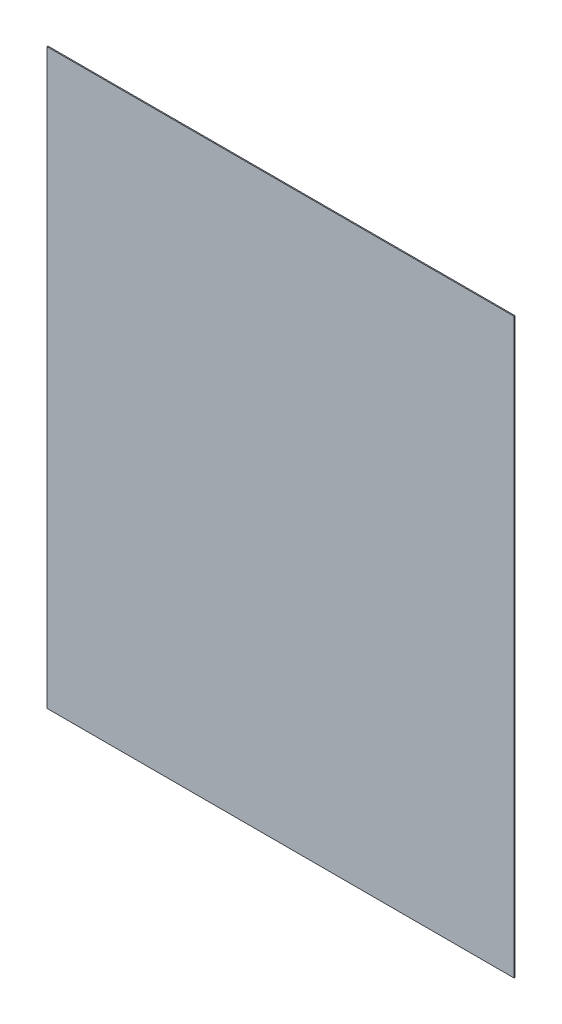
ISO-10303-21;
HEADER;
FILE_DESCRIPTION(('STEP AP214'),'2;1');
FILE_NAME('part.step','',(''),(''),'','','');
FILE_SCHEMA(('AUTOMOTIVE_DESIGN { 1 0 10303 214 1 1 1 1 }'));
ENDSEC;
DATA;
#1=APPLICATION_CONTEXT('core data for automotive mechanical design processes');
#2=APPLICATION_PROTOCOL_DEFINITION('international standard','automotive_design',2000,#1);
#3=PRODUCT_CONTEXT('',#1,'mechanical');
#4=PRODUCT('Part','Part','',(#3));
#5=PRODUCT_RELATED_PRODUCT_CATEGORY('part','',(#4));
#6=PRODUCT_DEFINITION_FORMATION('','',#4);
#7=PRODUCT_DEFINITION_CONTEXT('part definition',#1,'design');
#8=PRODUCT_DEFINITION('design','',#6,#7);
#9=PRODUCT_DEFINITION_SHAPE('','',#8);
#10=(LENGTH_UNIT() NAMED_UNIT(*) SI_UNIT(.MILLI.,.METRE.));
#11=(NAMED_UNIT(*) PLANE_ANGLE_UNIT() SI_UNIT($,.RADIAN.));
#12=(NAMED_UNIT(*) SI_UNIT($,.STERADIAN.) SOLID_ANGLE_UNIT());
#13=UNCERTAINTY_MEASURE_WITH_UNIT(LENGTH_MEASURE(1.E-05),#10,'distance_accuracy_value','');
#14=(GEOMETRIC_REPRESENTATION_CONTEXT(3) GLOBAL_UNCERTAINTY_ASSIGNED_CONTEXT((#13)) GLOBAL_UNIT_ASSIGNED_CONTEXT((#10,
#11,#12)) REPRESENTATION_CONTEXT('',''));
#15=CARTESIAN_POINT('',(0.,0.,0.));
#16=DIRECTION('',(0.,0.,1.));
#17=DIRECTION('',(1.,0.,0.));
#18=AXIS2_PLACEMENT_3D('',#15,#16,#17);
#19=CARTESIAN_POINT('',(0.,-135.,0.));
#20=DIRECTION('',(0.,1.,0.));
#21=DIRECTION('',(0.,0.,1.));
#22=AXIS2_PLACEMENT_3D('',#19,#20,#21);
#23=PLANE('',#22);
#24=DIRECTION('',(1.,0.,0.));
#25=VECTOR('',#24,1.);
#26=CARTESIAN_POINT('',(0.,-135.,-0.2435));
#27=LINE('',#26,#25);
#28=CARTESIAN_POINT('',(-110.,-135.,-0.2435));
#29=VERTEX_POINT('',#28);
#30=CARTESIAN_POINT('',(110.,-135.,-0.2435));
#31=VERTEX_POINT('',#30);
#32=EDGE_CURVE('E80',#29,#31,#27,.T.);
#33=ORIENTED_EDGE('',*,*,#32,.T.);
#34=DIRECTION('',(0.,0.,-1.));
#35=VECTOR('',#34,1.);
#36=CARTESIAN_POINT('',(110.,-135.,0.));
#37=LINE('',#36,#35);
#38=CARTESIAN_POINT('',(110.,-135.,0.2435));
#39=VERTEX_POINT('',#38);
#40=EDGE_CURVE('E55',#31,#39,#37,.F.);
#41=ORIENTED_EDGE('',*,*,#40,.T.);
#42=DIRECTION('',(1.,0.,0.));
#43=VECTOR('',#42,1.);
#44=CARTESIAN_POINT('',(0.,-135.,0.2435));
#45=LINE('',#44,#43);
#46=CARTESIAN_POINT('',(-110.,-135.,0.2435));
#47=VERTEX_POINT('',#46);
#48=EDGE_CURVE('E78',#39,#47,#45,.F.);
#49=ORIENTED_EDGE('',*,*,#48,.T.);
#50=DIRECTION('',(0.,0.,1.));
#51=VECTOR('',#50,1.);
#52=CARTESIAN_POINT('',(-110.,-135.,0.));
#53=LINE('',#52,#51);
#54=EDGE_CURVE('E20',#29,#47,#53,.T.);
#55=ORIENTED_EDGE('',*,*,#54,.F.);
#56=EDGE_LOOP('',(#33,#41,#49,#55));
#57=FACE_BOUND('',#56,.T.);
#58=ADVANCED_FACE('F17',(#57),#23,.F.);
#59=CARTESIAN_POINT('',(110.,0.,0.));
#60=DIRECTION('',(1.,0.,0.));
#61=DIRECTION('',(0.,0.,-1.));
#62=AXIS2_PLACEMENT_3D('',#59,#60,#61);
#63=PLANE('',#62);
#64=DIRECTION('',(0.,1.,0.));
#65=VECTOR('',#64,1.);
#66=CARTESIAN_POINT('',(110.,0.,-0.2435));
#67=LINE('',#66,#65);
#68=CARTESIAN_POINT('',(110.,135.,-0.2435));
#69=VERTEX_POINT('',#68);
#70=EDGE_CURVE('E67',#31,#69,#67,.T.);
#71=ORIENTED_EDGE('',*,*,#70,.T.);
#72=DIRECTION('',(0.,0.,-1.));
#73=VECTOR('',#72,1.);
#74=CARTESIAN_POINT('',(110.,135.,0.));
#75=LINE('',#74,#73);
#76=CARTESIAN_POINT('',(110.,135.,0.2435));
#77=VERTEX_POINT('',#76);
#78=EDGE_CURVE('E60',#69,#77,#75,.F.);
#79=ORIENTED_EDGE('',*,*,#78,.T.);
#80=DIRECTION('',(0.,1.,0.));
#81=VECTOR('',#80,1.);
#82=CARTESIAN_POINT('',(110.,0.,0.2435));
#83=LINE('',#82,#81);
#84=EDGE_CURVE('E64',#77,#39,#83,.F.);
#85=ORIENTED_EDGE('',*,*,#84,.T.);
#86=ORIENTED_EDGE('',*,*,#40,.F.);
#87=EDGE_LOOP('',(#71,#79,#85,#86));
#88=FACE_BOUND('',#87,.T.);
#89=ADVANCED_FACE('F62',(#88),#63,.T.);
#90=CARTESIAN_POINT('',(0.,135.,0.));
#91=DIRECTION('',(0.,-1.,0.));
#92=DIRECTION('',(0.,0.,-1.));
#93=AXIS2_PLACEMENT_3D('',#90,#91,#92);
#94=PLANE('',#93);
#95=DIRECTION('',(1.,0.,0.));
#96=VECTOR('',#95,1.);
#97=CARTESIAN_POINT('',(0.,135.,-0.2435));
#98=LINE('',#97,#96);
#99=CARTESIAN_POINT('',(-110.,135.,-0.2435));
#100=VERTEX_POINT('',#99);
#101=EDGE_CURVE('E86',#69,#100,#98,.F.);
#102=ORIENTED_EDGE('',*,*,#101,.T.);
#103=DIRECTION('',(0.,0.,-1.));
#104=VECTOR('',#103,1.);
#105=CARTESIAN_POINT('',(-110.,135.,0.));
#106=LINE('',#105,#104);
#107=CARTESIAN_POINT('',(-110.,135.,0.2435));
#108=VERTEX_POINT('',#107);
#109=EDGE_CURVE('E35',#108,#100,#106,.T.);
#110=ORIENTED_EDGE('',*,*,#109,.F.);
#111=DIRECTION('',(1.,0.,0.));
#112=VECTOR('',#111,1.);
#113=CARTESIAN_POINT('',(0.,135.,0.2435));
#114=LINE('',#113,#112);
#115=EDGE_CURVE('E70',#108,#77,#114,.T.);
#116=ORIENTED_EDGE('',*,*,#115,.T.);
#117=ORIENTED_EDGE('',*,*,#78,.F.);
#118=EDGE_LOOP('',(#102,#110,#116,#117));
#119=FACE_BOUND('',#118,.T.);
#120=ADVANCED_FACE('F73',(#119),#94,.F.);
#121=CARTESIAN_POINT('',(0.,0.,0.2435));
#122=DIRECTION('',(0.,0.,1.));
#123=DIRECTION('',(1.,0.,0.));
#124=AXIS2_PLACEMENT_3D('',#121,#122,#123);
#125=PLANE('',#124);
#126=ORIENTED_EDGE('',*,*,#48,.F.);
#127=ORIENTED_EDGE('',*,*,#84,.F.);
#128=ORIENTED_EDGE('',*,*,#115,.F.);
#129=DIRECTION('',(0.,1.,0.));
#130=VECTOR('',#129,1.);
#131=CARTESIAN_POINT('',(-110.,0.,0.2435));
#132=LINE('',#131,#130);
#133=EDGE_CURVE('E26',#108,#47,#132,.F.);
#134=ORIENTED_EDGE('',*,*,#133,.T.);
#135=EDGE_LOOP('',(#126,#127,#128,#134));
#136=FACE_BOUND('',#135,.T.);
#137=ADVANCED_FACE('F77',(#136),#125,.T.);
#138=CARTESIAN_POINT('',(0.,0.,-0.2435));
#139=DIRECTION('',(0.,0.,1.));
#140=DIRECTION('',(1.,0.,0.));
#141=AXIS2_PLACEMENT_3D('',#138,#139,#140);
#142=PLANE('',#141);
#143=ORIENTED_EDGE('',*,*,#70,.F.);
#144=ORIENTED_EDGE('',*,*,#32,.F.);
#145=DIRECTION('',(0.,1.,0.));
#146=VECTOR('',#145,1.);
#147=CARTESIAN_POINT('',(-110.,0.,-0.2435));
#148=LINE('',#147,#146);
#149=EDGE_CURVE('E11',#29,#100,#148,.T.);
#150=ORIENTED_EDGE('',*,*,#149,.T.);
#151=ORIENTED_EDGE('',*,*,#101,.F.);
#152=EDGE_LOOP('',(#143,#144,#150,#151));
#153=FACE_BOUND('',#152,.T.);
#154=ADVANCED_FACE('F91',(#153),#142,.F.);
#155=CARTESIAN_POINT('',(-110.,0.,0.));
#156=DIRECTION('',(-1.,0.,0.));
#157=DIRECTION('',(0.,0.,1.));
#158=AXIS2_PLACEMENT_3D('',#155,#156,#157);
#159=PLANE('',#158);
#160=ORIENTED_EDGE('',*,*,#149,.F.);
#161=ORIENTED_EDGE('',*,*,#54,.T.);
#162=ORIENTED_EDGE('',*,*,#133,.F.);
#163=ORIENTED_EDGE('',*,*,#109,.T.);
#164=EDGE_LOOP('',(#160,#161,#162,#163));
#165=FACE_BOUND('',#164,.T.);
#166=ADVANCED_FACE('F84',(#165),#159,.T.);
#167=CLOSED_SHELL('',(#58,#89,#120,#137,#154,#166));
#168=MANIFOLD_SOLID_BREP('B1',#167);
#169=ADVANCED_BREP_SHAPE_REPRESENTATION('',(#18,#168),#14);
#170=SHAPE_DEFINITION_REPRESENTATION(#9,#169);
ENDSEC;
END-ISO-10303-21;
